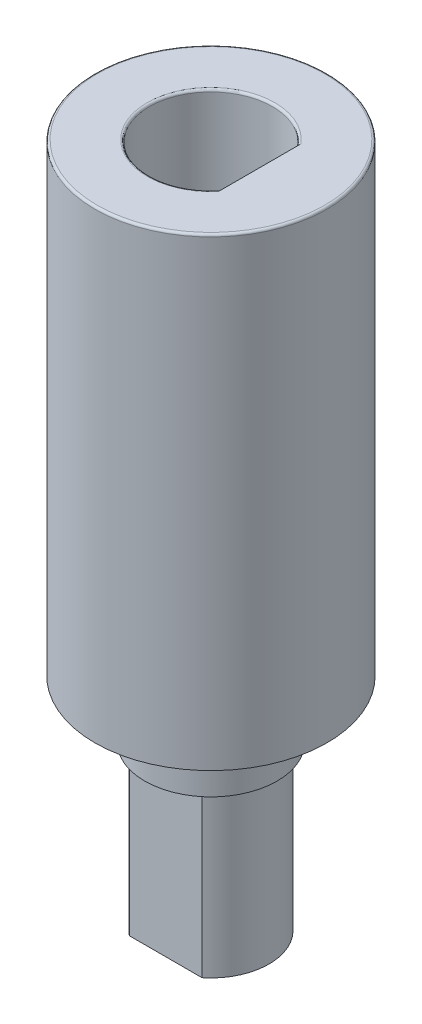
ISO-10303-21;
HEADER;
FILE_DESCRIPTION(('STEP AP214'),'2;1');
FILE_NAME('part.step','',(''),(''),'','','');
FILE_SCHEMA(('AUTOMOTIVE_DESIGN { 1 0 10303 214 1 1 1 1 }'));
ENDSEC;
DATA;
#1=APPLICATION_CONTEXT('core data for automotive mechanical design processes');
#2=APPLICATION_PROTOCOL_DEFINITION('international standard','automotive_design',2000,#1);
#3=PRODUCT_CONTEXT('',#1,'mechanical');
#4=PRODUCT('Part','Part','',(#3));
#5=PRODUCT_RELATED_PRODUCT_CATEGORY('part','',(#4));
#6=PRODUCT_DEFINITION_FORMATION('','',#4);
#7=PRODUCT_DEFINITION_CONTEXT('part definition',#1,'design');
#8=PRODUCT_DEFINITION('design','',#6,#7);
#9=PRODUCT_DEFINITION_SHAPE('','',#8);
#10=(LENGTH_UNIT() NAMED_UNIT(*) SI_UNIT(.MILLI.,.METRE.));
#11=(NAMED_UNIT(*) PLANE_ANGLE_UNIT() SI_UNIT($,.RADIAN.));
#12=(NAMED_UNIT(*) SI_UNIT($,.STERADIAN.) SOLID_ANGLE_UNIT());
#13=UNCERTAINTY_MEASURE_WITH_UNIT(LENGTH_MEASURE(1.E-05),#10,'distance_accuracy_value','');
#14=(GEOMETRIC_REPRESENTATION_CONTEXT(3) GLOBAL_UNCERTAINTY_ASSIGNED_CONTEXT((#13)) GLOBAL_UNIT_ASSIGNED_CONTEXT((#10,
#11,#12)) REPRESENTATION_CONTEXT('',''));
#15=CARTESIAN_POINT('',(0.,0.,0.));
#16=DIRECTION('',(0.,0.,1.));
#17=DIRECTION('',(1.,0.,0.));
#18=AXIS2_PLACEMENT_3D('',#15,#16,#17);
#19=CARTESIAN_POINT('',(0.,0.,0.));
#20=DIRECTION('',(0.,1.,0.));
#21=DIRECTION('',(0.,0.,1.));
#22=AXIS2_PLACEMENT_3D('',#19,#20,#21);
#23=PLANE('',#22);
#24=CARTESIAN_POINT('',(0.,0.,0.));
#25=DIRECTION('',(0.,1.,0.));
#26=DIRECTION('',(0.,0.,1.));
#27=AXIS2_PLACEMENT_3D('',#24,#25,#26);
#28=CIRCLE('',#27,2.85);
#29=CARTESIAN_POINT('',(0.,0.,2.85));
#30=VERTEX_POINT('',#29);
#31=EDGE_CURVE('E122',#30,#30,#28,.F.);
#32=ORIENTED_EDGE('',*,*,#31,.F.);
#33=EDGE_LOOP('',(#32));
#34=FACE_BOUND('',#33,.T.);
#35=CARTESIAN_POINT('',(0.,0.,0.));
#36=DIRECTION('',(0.,1.,0.));
#37=DIRECTION('',(0.,0.,1.));
#38=AXIS2_PLACEMENT_3D('',#35,#36,#37);
#39=CIRCLE('',#38,5.);
#40=CARTESIAN_POINT('',(0.,0.,5.));
#41=VERTEX_POINT('',#40);
#42=EDGE_CURVE('E125',#41,#41,#39,.T.);
#43=ORIENTED_EDGE('',*,*,#42,.F.);
#44=EDGE_LOOP('',(#43));
#45=FACE_BOUND('',#44,.T.);
#46=ADVANCED_FACE('F44',(#34,#45),#23,.F.);
#47=CARTESIAN_POINT('',(0.,20.,0.));
#48=DIRECTION('',(0.,-1.,0.));
#49=DIRECTION('',(0.,0.,-1.));
#50=AXIS2_PLACEMENT_3D('',#47,#48,#49);
#51=CYLINDRICAL_SURFACE('',#50,5.);
#52=CARTESIAN_POINT('',(0.,19.9,0.));
#53=DIRECTION('',(0.,1.,0.));
#54=DIRECTION('',(0.,0.,1.));
#55=AXIS2_PLACEMENT_3D('',#52,#53,#54);
#56=CIRCLE('',#55,5.);
#57=CARTESIAN_POINT('',(0.,19.9,5.));
#58=VERTEX_POINT('',#57);
#59=EDGE_CURVE('E183',#58,#58,#56,.F.);
#60=ORIENTED_EDGE('',*,*,#59,.T.);
#61=EDGE_LOOP('',(#60));
#62=FACE_BOUND('',#61,.T.);
#63=ORIENTED_EDGE('',*,*,#42,.T.);
#64=EDGE_LOOP('',(#63));
#65=FACE_BOUND('',#64,.T.);
#66=ADVANCED_FACE('F208',(#62,#65),#51,.T.);
#67=CARTESIAN_POINT('',(0.,20.,0.));
#68=DIRECTION('',(0.,1.,0.));
#69=DIRECTION('',(0.,0.,1.));
#70=AXIS2_PLACEMENT_3D('',#67,#68,#69);
#71=PLANE('',#70);
#72=CARTESIAN_POINT('',(0.,20.,0.));
#73=DIRECTION('',(0.,1.,0.));
#74=DIRECTION('',(0.,0.,1.));
#75=AXIS2_PLACEMENT_3D('',#72,#73,#74);
#76=CIRCLE('',#75,4.9);
#77=CARTESIAN_POINT('',(0.,20.,4.9));
#78=VERTEX_POINT('',#77);
#79=EDGE_CURVE('E179',#78,#78,#76,.T.);
#80=ORIENTED_EDGE('',*,*,#79,.T.);
#81=EDGE_LOOP('',(#80));
#82=FACE_BOUND('',#81,.T.);
#83=DIRECTION('',(0.,0.,-1.));
#84=VECTOR('',#83,1.);
#85=CARTESIAN_POINT('',(2.1,20.,-1.61632298752446));
#86=LINE('',#85,#84);
#87=CARTESIAN_POINT('',(2.1,20.,1.77552809045647));
#88=VERTEX_POINT('',#87);
#89=CARTESIAN_POINT('',(2.1,20.,-1.77552809045647));
#90=VERTEX_POINT('',#89);
#91=EDGE_CURVE('E154',#88,#90,#86,.T.);
#92=ORIENTED_EDGE('',*,*,#91,.F.);
#93=CARTESIAN_POINT('',(0.,20.,0.));
#94=DIRECTION('',(0.,1.,0.));
#95=DIRECTION('',(0.,0.,1.));
#96=AXIS2_PLACEMENT_3D('',#93,#94,#95);
#97=CIRCLE('',#96,2.75);
#98=EDGE_CURVE('E176',#88,#90,#97,.F.);
#99=ORIENTED_EDGE('',*,*,#98,.T.);
#100=EDGE_LOOP('',(#92,#99));
#101=FACE_BOUND('',#100,.T.);
#102=ADVANCED_FACE('F207',(#82,#101),#71,.T.);
#103=CARTESIAN_POINT('',(0.,5.,0.));
#104=DIRECTION('',(0.,1.,0.));
#105=DIRECTION('',(0.,0.,1.));
#106=AXIS2_PLACEMENT_3D('',#103,#104,#105);
#107=CYLINDRICAL_SURFACE('',#106,2.65);
#108=DIRECTION('',(0.,1.,0.));
#109=VECTOR('',#108,1.);
#110=CARTESIAN_POINT('',(2.1,5.,-1.61632298752446));
#111=LINE('',#110,#109);
#112=CARTESIAN_POINT('',(2.1,5.,-1.61632298752446));
#113=VERTEX_POINT('',#112);
#114=CARTESIAN_POINT('',(2.1,19.9,-1.61632298752446));
#115=VERTEX_POINT('',#114);
#116=EDGE_CURVE('E165',#113,#115,#111,.T.);
#117=ORIENTED_EDGE('',*,*,#116,.T.);
#118=CARTESIAN_POINT('',(0.,19.9,0.));
#119=DIRECTION('',(0.,1.,0.));
#120=DIRECTION('',(0.,0.,1.));
#121=AXIS2_PLACEMENT_3D('',#118,#119,#120);
#122=CIRCLE('',#121,2.65);
#123=CARTESIAN_POINT('',(2.1,19.9,1.61632298752446));
#124=VERTEX_POINT('',#123);
#125=EDGE_CURVE('E189',#115,#124,#122,.T.);
#126=ORIENTED_EDGE('',*,*,#125,.T.);
#127=DIRECTION('',(0.,1.,0.));
#128=VECTOR('',#127,1.);
#129=CARTESIAN_POINT('',(2.1,5.,1.61632298752446));
#130=LINE('',#129,#128);
#131=CARTESIAN_POINT('',(2.1,5.,1.61632298752446));
#132=VERTEX_POINT('',#131);
#133=EDGE_CURVE('E163',#132,#124,#130,.T.);
#134=ORIENTED_EDGE('',*,*,#133,.F.);
#135=CARTESIAN_POINT('',(0.,5.,0.));
#136=DIRECTION('',(0.,1.,0.));
#137=DIRECTION('',(0.,0.,1.));
#138=AXIS2_PLACEMENT_3D('',#135,#136,#137);
#139=CIRCLE('',#138,2.65);
#140=EDGE_CURVE('E155',#113,#132,#139,.T.);
#141=ORIENTED_EDGE('',*,*,#140,.F.);
#142=EDGE_LOOP('',(#117,#126,#134,#141));
#143=FACE_BOUND('',#142,.T.);
#144=ADVANCED_FACE('F203',(#143),#107,.F.);
#145=CARTESIAN_POINT('',(2.1,5.,-1.61632298752446));
#146=DIRECTION('',(1.,0.,0.));
#147=DIRECTION('',(0.,0.,-1.));
#148=AXIS2_PLACEMENT_3D('',#145,#146,#147);
#149=PLANE('',#148);
#150=ORIENTED_EDGE('',*,*,#91,.T.);
#151=CARTESIAN_POINT('',(2.1,20.,-1.77552809045647));
#152=CARTESIAN_POINT('',(2.1,19.9999611800387,-1.76223461138872));
#153=CARTESIAN_POINT('',(2.1,19.9988870952707,-1.74888075788546));
#154=CARTESIAN_POINT('',(2.1,19.9944581956468,-1.72240478098411));
#155=CARTESIAN_POINT('',(2.1,19.991077068897,-1.70928714253861));
#156=CARTESIAN_POINT('',(2.1,19.9837340604896,-1.68921233966633));
#157=CARTESIAN_POINT('',(2.1,19.9805929604559,-1.68195421494824));
#158=CARTESIAN_POINT('',(2.1,19.9733489391149,-1.66794644639236));
#159=CARTESIAN_POINT('',(2.1,19.9692491036806,-1.6611952610935));
#160=CARTESIAN_POINT('',(2.1,19.9612843305441,-1.65030537202726));
#161=CARTESIAN_POINT('',(2.1,19.9576873824623,-1.64597161210759));
#162=CARTESIAN_POINT('',(2.1,19.9498810568078,-1.63788722353666));
#163=CARTESIAN_POINT('',(2.1,19.945672438484,-1.63413588371251));
#164=CARTESIAN_POINT('',(2.1,19.9378475446747,-1.62837603776653));
#165=CARTESIAN_POINT('',(2.1,19.9343773149731,-1.62617030023974));
#166=CARTESIAN_POINT('',(2.1,19.9271337664975,-1.6223447441634));
#167=CARTESIAN_POINT('',(2.1,19.9233614191882,-1.62072313303681));
#168=CARTESIAN_POINT('',(2.1,19.9163437437088,-1.61844282185512));
#169=CARTESIAN_POINT('',(2.1,19.9131396803714,-1.61765781051825));
#170=CARTESIAN_POINT('',(2.1,19.9066263150364,-1.61659321354244));
#171=CARTESIAN_POINT('',(2.1,19.9033164299274,-1.61631723386117));
#172=CARTESIAN_POINT('',(2.1,19.9,-1.61632298752446));
#173=B_SPLINE_CURVE_WITH_KNOTS('',3,(#151,#152,#153,#154,#155,#156,#157,#158,#159,#160,#161,
#162,#163,#164,#165,#166,#167,#168,#169,#170,#171,#172),.UNSPECIFIED.,.F.,.F.,(4,2,2,2,2,2,2,2,
2,2,4),(0.,0.0399467351143188,0.0803568515341918,0.104027170444318,0.127622325817175,
0.144471277144947,0.161299490194818,0.173592407683382,0.18584727243528,0.195704799131865,
0.205631891806228),.UNSPECIFIED.);
#174=EDGE_CURVE('E11',#90,#115,#173,.T.);
#175=ORIENTED_EDGE('',*,*,#174,.T.);
#176=ORIENTED_EDGE('',*,*,#116,.F.);
#177=DIRECTION('',(0.,0.,-1.));
#178=VECTOR('',#177,1.);
#179=CARTESIAN_POINT('',(2.1,5.,-1.61632298752446));
#180=LINE('',#179,#178);
#181=EDGE_CURVE('E160',#132,#113,#180,.T.);
#182=ORIENTED_EDGE('',*,*,#181,.F.);
#183=ORIENTED_EDGE('',*,*,#133,.T.);
#184=CARTESIAN_POINT('',(2.1,19.9,1.61632298752446));
#185=CARTESIAN_POINT('',(2.1,19.9041722248331,1.61630979111146));
#186=CARTESIAN_POINT('',(2.1,19.9083275256069,1.61675020245464));
#187=CARTESIAN_POINT('',(2.1,19.9164280677135,1.61841670864656));
#188=CARTESIAN_POINT('',(2.1,19.9203752340259,1.61963329287925));
#189=CARTESIAN_POINT('',(2.1,19.9279719935809,1.62272852121475));
#190=CARTESIAN_POINT('',(2.1,19.9316228832381,1.62460406547304));
#191=CARTESIAN_POINT('',(2.1,19.9386104800536,1.62888312036024));
#192=CARTESIAN_POINT('',(2.1,19.9419461261882,1.63128832915739));
#193=CARTESIAN_POINT('',(2.1,19.9500313252346,1.63794323013316));
#194=CARTESIAN_POINT('',(2.1,19.9545452268691,1.64247829220406));
#195=CARTESIAN_POINT('',(2.1,19.9628162001537,1.65218822624035));
#196=CARTESIAN_POINT('',(2.1,19.9665715717747,1.65736449433467));
#197=CARTESIAN_POINT('',(2.1,19.975314396841,1.6711623561342));
#198=CARTESIAN_POINT('',(2.1,19.9798155063528,1.68009114135738));
#199=CARTESIAN_POINT('',(2.1,19.9874011423703,1.69853474671771));
#200=CARTESIAN_POINT('',(2.1,19.9904818113731,1.70805108402681));
#201=CARTESIAN_POINT('',(2.1,19.995306285754,1.72720403871192));
#202=CARTESIAN_POINT('',(2.1,19.9970762821395,1.73683415734462));
#203=CARTESIAN_POINT('',(2.1,19.9994127375359,1.75615535658681));
#204=CARTESIAN_POINT('',(2.1,19.9999895374607,1.76584517712245));
#205=CARTESIAN_POINT('',(2.1,20.,1.77552809045647));
#206=B_SPLINE_CURVE_WITH_KNOTS('',3,(#184,#185,#186,#187,#188,#189,#190,#191,#192,#193,#194,
#195,#196,#197,#198,#199,#200,#201,#202,#203,#204,#205),.UNSPECIFIED.,.F.,.F.,(4,2,2,2,2,2,2,2,
2,2,4),(0.,0.0124666917510531,0.0247834858101794,0.0370430989560041,0.0493426054748885,
0.0684300465643806,0.0875598032982704,0.117393375363946,0.147307496328055,0.176606401724083,
0.205650303966393),.UNSPECIFIED.);
#207=EDGE_CURVE('E58',#124,#88,#206,.T.);
#208=ORIENTED_EDGE('',*,*,#207,.T.);
#209=EDGE_LOOP('',(#150,#175,#176,#182,#183,#208));
#210=FACE_BOUND('',#209,.T.);
#211=ADVANCED_FACE('F195',(#210),#149,.F.);
#212=CARTESIAN_POINT('',(0.,5.,0.));
#213=DIRECTION('',(0.,1.,0.));
#214=DIRECTION('',(0.,0.,1.));
#215=AXIS2_PLACEMENT_3D('',#212,#213,#214);
#216=PLANE('',#215);
#217=ORIENTED_EDGE('',*,*,#140,.T.);
#218=ORIENTED_EDGE('',*,*,#181,.T.);
#219=EDGE_LOOP('',(#217,#218));
#220=FACE_BOUND('',#219,.T.);
#221=ADVANCED_FACE('F198',(#220),#216,.T.);
#222=CARTESIAN_POINT('',(0.,-2.5,0.));
#223=DIRECTION('',(0.,-1.,0.));
#224=DIRECTION('',(0.,0.,-1.));
#225=AXIS2_PLACEMENT_3D('',#222,#223,#224);
#226=PLANE('',#225);
#227=CARTESIAN_POINT('',(0.,-2.5,0.));
#228=DIRECTION('',(0.,-1.,0.));
#229=DIRECTION('',(0.,0.,-1.));
#230=AXIS2_PLACEMENT_3D('',#227,#228,#229);
#231=CIRCLE('',#230,2.85);
#232=CARTESIAN_POINT('',(0.,-2.5,-2.85));
#233=VERTEX_POINT('',#232);
#234=EDGE_CURVE('E133',#233,#233,#231,.T.);
#235=ORIENTED_EDGE('',*,*,#234,.T.);
#236=EDGE_LOOP('',(#235));
#237=FACE_BOUND('',#236,.T.);
#238=CARTESIAN_POINT('',(0.,-2.5,0.));
#239=DIRECTION('',(0.,-1.,0.));
#240=DIRECTION('',(0.,0.,-1.));
#241=AXIS2_PLACEMENT_3D('',#238,#239,#240);
#242=CIRCLE('',#241,2.5);
#243=CARTESIAN_POINT('',(1.5644487847162,-2.5,-1.95));
#244=VERTEX_POINT('',#243);
#245=CARTESIAN_POINT('',(1.5644487847162,-2.5,1.95));
#246=VERTEX_POINT('',#245);
#247=EDGE_CURVE('E114',#244,#246,#242,.T.);
#248=ORIENTED_EDGE('',*,*,#247,.F.);
#249=DIRECTION('',(1.,0.,0.));
#250=VECTOR('',#249,1.);
#251=CARTESIAN_POINT('',(-1.5644487847162,-2.5,-1.95));
#252=LINE('',#251,#250);
#253=CARTESIAN_POINT('',(-1.5644487847162,-2.5,-1.95));
#254=VERTEX_POINT('',#253);
#255=EDGE_CURVE('E107',#254,#244,#252,.T.);
#256=ORIENTED_EDGE('',*,*,#255,.F.);
#257=CARTESIAN_POINT('',(0.,-2.5,0.));
#258=DIRECTION('',(0.,-1.,0.));
#259=DIRECTION('',(0.,0.,-1.));
#260=AXIS2_PLACEMENT_3D('',#257,#258,#259);
#261=CIRCLE('',#260,2.5);
#262=CARTESIAN_POINT('',(-1.5644487847162,-2.5,1.95));
#263=VERTEX_POINT('',#262);
#264=EDGE_CURVE('E115',#263,#254,#261,.T.);
#265=ORIENTED_EDGE('',*,*,#264,.F.);
#266=DIRECTION('',(-1.,0.,0.));
#267=VECTOR('',#266,1.);
#268=CARTESIAN_POINT('',(-1.5644487847162,-2.5,1.95));
#269=LINE('',#268,#267);
#270=EDGE_CURVE('E131',#246,#263,#269,.T.);
#271=ORIENTED_EDGE('',*,*,#270,.F.);
#272=EDGE_LOOP('',(#248,#256,#265,#271));
#273=FACE_BOUND('',#272,.T.);
#274=ADVANCED_FACE('F111',(#237,#273),#226,.T.);
#275=CARTESIAN_POINT('',(0.,-2.5,0.));
#276=DIRECTION('',(0.,1.,0.));
#277=DIRECTION('',(0.,0.,1.));
#278=AXIS2_PLACEMENT_3D('',#275,#276,#277);
#279=CYLINDRICAL_SURFACE('',#278,2.85);
#280=ORIENTED_EDGE('',*,*,#234,.F.);
#281=EDGE_LOOP('',(#280));
#282=FACE_BOUND('',#281,.T.);
#283=ORIENTED_EDGE('',*,*,#31,.T.);
#284=EDGE_LOOP('',(#283));
#285=FACE_BOUND('',#284,.T.);
#286=ADVANCED_FACE('F237',(#282,#285),#279,.T.);
#287=CARTESIAN_POINT('',(0.,-9.5,0.));
#288=DIRECTION('',(0.,1.,0.));
#289=DIRECTION('',(0.,0.,1.));
#290=AXIS2_PLACEMENT_3D('',#287,#288,#289);
#291=PLANE('',#290);
#292=CARTESIAN_POINT('',(0.,-9.5,0.));
#293=DIRECTION('',(0.,-1.,0.));
#294=DIRECTION('',(0.,0.,1.));
#295=AXIS2_PLACEMENT_3D('',#292,#293,#294);
#296=CIRCLE('',#295,2.5);
#297=CARTESIAN_POINT('',(1.5644487847162,-9.5,-1.95));
#298=VERTEX_POINT('',#297);
#299=CARTESIAN_POINT('',(1.5644487847162,-9.5,1.95));
#300=VERTEX_POINT('',#299);
#301=EDGE_CURVE('E261',#298,#300,#296,.T.);
#302=ORIENTED_EDGE('',*,*,#301,.T.);
#303=DIRECTION('',(-1.,0.,0.));
#304=VECTOR('',#303,1.);
#305=CARTESIAN_POINT('',(-1.5644487847162,-9.5,1.95));
#306=LINE('',#305,#304);
#307=CARTESIAN_POINT('',(-1.5644487847162,-9.5,1.95));
#308=VERTEX_POINT('',#307);
#309=EDGE_CURVE('E262',#300,#308,#306,.T.);
#310=ORIENTED_EDGE('',*,*,#309,.T.);
#311=CARTESIAN_POINT('',(0.,-9.5,0.));
#312=DIRECTION('',(0.,-1.,0.));
#313=DIRECTION('',(0.,0.,-1.));
#314=AXIS2_PLACEMENT_3D('',#311,#312,#313);
#315=CIRCLE('',#314,2.5);
#316=CARTESIAN_POINT('',(-1.5644487847162,-9.5,-1.95));
#317=VERTEX_POINT('',#316);
#318=EDGE_CURVE('E274',#308,#317,#315,.T.);
#319=ORIENTED_EDGE('',*,*,#318,.T.);
#320=DIRECTION('',(1.,0.,0.));
#321=VECTOR('',#320,1.);
#322=CARTESIAN_POINT('',(-1.5644487847162,-9.5,-1.95));
#323=LINE('',#322,#321);
#324=EDGE_CURVE('E136',#317,#298,#323,.T.);
#325=ORIENTED_EDGE('',*,*,#324,.T.);
#326=EDGE_LOOP('',(#302,#310,#319,#325));
#327=FACE_BOUND('',#326,.T.);
#328=ADVANCED_FACE('F244',(#327),#291,.F.);
#329=CARTESIAN_POINT('',(-1.5644487847162,-9.5,-1.95));
#330=DIRECTION('',(0.,0.,1.));
#331=DIRECTION('',(1.,0.,0.));
#332=AXIS2_PLACEMENT_3D('',#329,#330,#331);
#333=PLANE('',#332);
#334=DIRECTION('',(0.,1.,0.));
#335=VECTOR('',#334,1.);
#336=CARTESIAN_POINT('',(-1.5644487847162,-9.5,-1.95));
#337=LINE('',#336,#335);
#338=EDGE_CURVE('E128',#317,#254,#337,.T.);
#339=ORIENTED_EDGE('',*,*,#338,.T.);
#340=ORIENTED_EDGE('',*,*,#255,.T.);
#341=DIRECTION('',(0.,1.,0.));
#342=VECTOR('',#341,1.);
#343=CARTESIAN_POINT('',(1.5644487847162,-9.5,-1.95));
#344=LINE('',#343,#342);
#345=EDGE_CURVE('E137',#298,#244,#344,.T.);
#346=ORIENTED_EDGE('',*,*,#345,.F.);
#347=ORIENTED_EDGE('',*,*,#324,.F.);
#348=EDGE_LOOP('',(#339,#340,#346,#347));
#349=FACE_BOUND('',#348,.T.);
#350=ADVANCED_FACE('F140',(#349),#333,.F.);
#351=CARTESIAN_POINT('',(0.,-9.5,0.));
#352=DIRECTION('',(0.,1.,0.));
#353=DIRECTION('',(0.,0.,1.));
#354=AXIS2_PLACEMENT_3D('',#351,#352,#353);
#355=CYLINDRICAL_SURFACE('',#354,2.5);
#356=DIRECTION('',(0.,1.,0.));
#357=VECTOR('',#356,1.);
#358=CARTESIAN_POINT('',(-1.5644487847162,-9.5,1.95));
#359=LINE('',#358,#357);
#360=EDGE_CURVE('E134',#308,#263,#359,.T.);
#361=ORIENTED_EDGE('',*,*,#360,.T.);
#362=ORIENTED_EDGE('',*,*,#264,.T.);
#363=ORIENTED_EDGE('',*,*,#338,.F.);
#364=ORIENTED_EDGE('',*,*,#318,.F.);
#365=EDGE_LOOP('',(#361,#362,#363,#364));
#366=FACE_BOUND('',#365,.T.);
#367=ADVANCED_FACE('F127',(#366),#355,.T.);
#368=CARTESIAN_POINT('',(-1.5644487847162,-9.5,1.95));
#369=DIRECTION('',(0.,0.,-1.));
#370=DIRECTION('',(-1.,0.,0.));
#371=AXIS2_PLACEMENT_3D('',#368,#369,#370);
#372=PLANE('',#371);
#373=DIRECTION('',(0.,1.,0.));
#374=VECTOR('',#373,1.);
#375=CARTESIAN_POINT('',(1.5644487847162,-9.5,1.95));
#376=LINE('',#375,#374);
#377=EDGE_CURVE('E144',#300,#246,#376,.T.);
#378=ORIENTED_EDGE('',*,*,#377,.T.);
#379=ORIENTED_EDGE('',*,*,#270,.T.);
#380=ORIENTED_EDGE('',*,*,#360,.F.);
#381=ORIENTED_EDGE('',*,*,#309,.F.);
#382=EDGE_LOOP('',(#378,#379,#380,#381));
#383=FACE_BOUND('',#382,.T.);
#384=ADVANCED_FACE('F222',(#383),#372,.F.);
#385=CARTESIAN_POINT('',(0.,-9.5,0.));
#386=DIRECTION('',(0.,1.,0.));
#387=DIRECTION('',(0.,0.,1.));
#388=AXIS2_PLACEMENT_3D('',#385,#386,#387);
#389=CYLINDRICAL_SURFACE('',#388,2.5);
#390=ORIENTED_EDGE('',*,*,#345,.T.);
#391=ORIENTED_EDGE('',*,*,#247,.T.);
#392=ORIENTED_EDGE('',*,*,#377,.F.);
#393=ORIENTED_EDGE('',*,*,#301,.F.);
#394=EDGE_LOOP('',(#390,#391,#392,#393));
#395=FACE_BOUND('',#394,.T.);
#396=ADVANCED_FACE('F216',(#395),#389,.T.);
#397=CARTESIAN_POINT('',(0.,19.9,0.));
#398=DIRECTION('',(0.,1.,0.));
#399=DIRECTION('',(0.,0.,1.));
#400=AXIS2_PLACEMENT_3D('',#397,#398,#399);
#401=TOROIDAL_SURFACE('',#400,4.9,0.1);
#402=ORIENTED_EDGE('',*,*,#59,.F.);
#403=EDGE_LOOP('',(#402));
#404=FACE_BOUND('',#403,.T.);
#405=ORIENTED_EDGE('',*,*,#79,.F.);
#406=EDGE_LOOP('',(#405));
#407=FACE_BOUND('',#406,.T.);
#408=ADVANCED_FACE('F219',(#404,#407),#401,.T.);
#409=CARTESIAN_POINT('',(0.,19.9,0.));
#410=DIRECTION('',(0.,1.,0.));
#411=DIRECTION('',(0.,0.,1.));
#412=AXIS2_PLACEMENT_3D('',#409,#410,#411);
#413=TOROIDAL_SURFACE('',#412,2.75,0.1);
#414=ORIENTED_EDGE('',*,*,#174,.F.);
#415=ORIENTED_EDGE('',*,*,#98,.F.);
#416=ORIENTED_EDGE('',*,*,#207,.F.);
#417=ORIENTED_EDGE('',*,*,#125,.F.);
#418=EDGE_LOOP('',(#414,#415,#416,#417));
#419=FACE_BOUND('',#418,.T.);
#420=ADVANCED_FACE('F50',(#419),#413,.T.);
#421=CLOSED_SHELL('',(#46,#66,#102,#144,#211,#221,#274,#286,#328,#350,#367,#384,#396,#408,#420));
#422=MANIFOLD_SOLID_BREP('B2',#421);
#423=ADVANCED_BREP_SHAPE_REPRESENTATION('',(#18,#422),#14);
#424=SHAPE_DEFINITION_REPRESENTATION(#9,#423);
ENDSEC;
END-ISO-10303-21;
